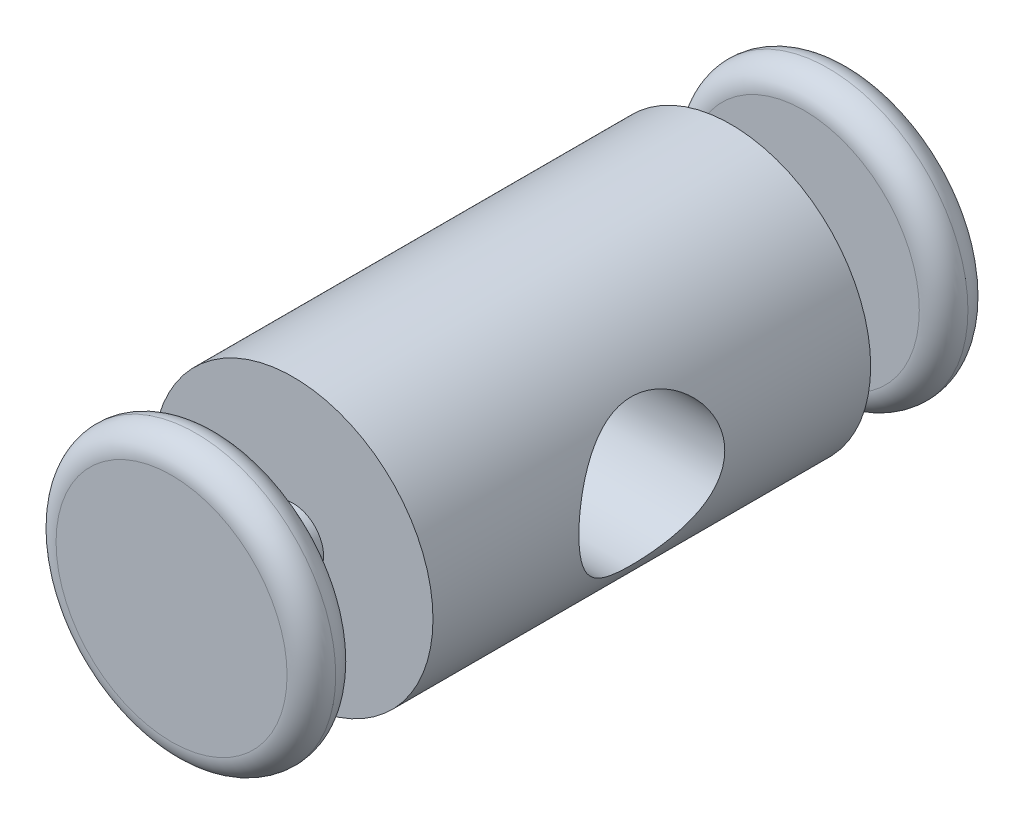
ISO-10303-21;
HEADER;
FILE_DESCRIPTION(('STEP AP214'),'2;1');
FILE_NAME('part.step','',(''),(''),'','','');
FILE_SCHEMA(('AUTOMOTIVE_DESIGN { 1 0 10303 214 1 1 1 1 }'));
ENDSEC;
DATA;
#1=APPLICATION_CONTEXT('core data for automotive mechanical design processes');
#2=APPLICATION_PROTOCOL_DEFINITION('international standard','automotive_design',2000,#1);
#3=PRODUCT_CONTEXT('',#1,'mechanical');
#4=PRODUCT('Part','Part','',(#3));
#5=PRODUCT_RELATED_PRODUCT_CATEGORY('part','',(#4));
#6=PRODUCT_DEFINITION_FORMATION('','',#4);
#7=PRODUCT_DEFINITION_CONTEXT('part definition',#1,'design');
#8=PRODUCT_DEFINITION('design','',#6,#7);
#9=PRODUCT_DEFINITION_SHAPE('','',#8);
#10=(LENGTH_UNIT() NAMED_UNIT(*) SI_UNIT(.MILLI.,.METRE.));
#11=(NAMED_UNIT(*) PLANE_ANGLE_UNIT() SI_UNIT($,.RADIAN.));
#12=(NAMED_UNIT(*) SI_UNIT($,.STERADIAN.) SOLID_ANGLE_UNIT());
#13=UNCERTAINTY_MEASURE_WITH_UNIT(LENGTH_MEASURE(1.E-05),#10,'distance_accuracy_value','');
#14=(GEOMETRIC_REPRESENTATION_CONTEXT(3) GLOBAL_UNCERTAINTY_ASSIGNED_CONTEXT((#13)) GLOBAL_UNIT_ASSIGNED_CONTEXT((#10,
#11,#12)) REPRESENTATION_CONTEXT('',''));
#15=CARTESIAN_POINT('',(0.,0.,0.));
#16=DIRECTION('',(0.,0.,1.));
#17=DIRECTION('',(1.,0.,0.));
#18=AXIS2_PLACEMENT_3D('',#15,#16,#17);
#19=CARTESIAN_POINT('',(0.,0.,18.));
#20=DIRECTION('',(0.,0.,-1.));
#21=DIRECTION('',(-1.,0.,0.));
#22=AXIS2_PLACEMENT_3D('',#19,#20,#21);
#23=CYLINDRICAL_SURFACE('',#22,11.5);
#24=CARTESIAN_POINT('',(-11.5,0.,-6.));
#25=CARTESIAN_POINT('',(-11.5000001355779,0.156949578828013,-6.00000018262045));
#26=CARTESIAN_POINT('',(-11.496779962264,0.31389754169482,-5.99383515190377));
#27=CARTESIAN_POINT('',(-11.4839818639018,0.62662672321278,-5.96925032429299));
#28=CARTESIAN_POINT('',(-11.4744015461444,0.782407480443761,-5.95082591537107));
#29=CARTESIAN_POINT('',(-11.449113177051,1.09175175440846,-5.90191753135049));
#30=CARTESIAN_POINT('',(-11.4333976079975,1.24531231034333,-5.87141876050534));
#31=CARTESIAN_POINT('',(-11.3962303126682,1.54898348882052,-5.79871024455504));
#32=CARTESIAN_POINT('',(-11.374776242212,1.69909267420191,-5.75649571329124));
#33=CARTESIAN_POINT('',(-11.3267626640489,1.99416223199407,-5.66102891920832));
#34=CARTESIAN_POINT('',(-11.3002263208967,2.1391425588515,-5.60782665445636));
#35=CARTESIAN_POINT('',(-11.242605583116,2.42383122801699,-5.49078903598036));
#36=CARTESIAN_POINT('',(-11.2115194736562,2.5635375574422,-5.42694967181545));
#37=CARTESIAN_POINT('',(-11.1124815994392,2.97347192891134,-5.22033899187204));
#38=CARTESIAN_POINT('',(-11.0386979829442,3.23482328090003,-5.06237435139018));
#39=CARTESIAN_POINT('',(-10.8767973262684,3.74452958045324,-4.69923611516626));
#40=CARTESIAN_POINT('',(-10.7880643171826,3.99097418237579,-4.49168348355608));
#41=CARTESIAN_POINT('',(-10.6080279075606,4.44746391289365,-4.04018397814692));
#42=CARTESIAN_POINT('',(-10.5167224332789,4.65747863814188,-3.79620701855532));
#43=CARTESIAN_POINT('',(-10.3807564849467,4.9500372667915,-3.39525217625011));
#44=CARTESIAN_POINT('',(-10.3338194266376,5.04702452632478,-3.24936331256475));
#45=CARTESIAN_POINT('',(-10.243318226809,5.22825678412562,-2.94891015824408));
#46=CARTESIAN_POINT('',(-10.1997526568336,5.3125071934178,-2.79434959010944));
#47=CARTESIAN_POINT('',(-10.1175068939614,5.46751898205415,-2.47737077950324));
#48=CARTESIAN_POINT('',(-10.0788263293965,5.53828138782106,-2.31495313612708));
#49=CARTESIAN_POINT('',(-10.0078700406709,5.66549605291697,-1.98334549078617));
#50=CARTESIAN_POINT('',(-9.97559037714005,5.72195711983363,-1.81415973172985));
#51=CARTESIAN_POINT('',(-9.92054619063594,5.81683662761802,-1.48073913098547));
#52=CARTESIAN_POINT('',(-9.89732024339665,5.85614780407481,-1.3168349660179));
#53=CARTESIAN_POINT('',(-9.85870819120575,5.92092061333048,-0.985481152489066));
#54=CARTESIAN_POINT('',(-9.84331774125874,5.94638992234961,-0.818033522652497));
#55=CARTESIAN_POINT('',(-9.82106263754177,5.98307546018693,-0.481141485903813));
#56=CARTESIAN_POINT('',(-9.81419169245375,5.99430220671729,-0.311698645834845));
#57=CARTESIAN_POINT('',(-9.80928110826297,6.00233545828592,0.0276480579803447));
#58=CARTESIAN_POINT('',(-9.81124048475129,5.99914357072103,0.19755186822696));
#59=CARTESIAN_POINT('',(-9.82304398186207,5.97979128876469,0.51352360962145));
#60=CARTESIAN_POINT('',(-9.8318008420255,5.96541862727512,0.659746262263789));
#61=CARTESIAN_POINT('',(-9.85556101429154,5.92608183096438,0.950290027245845));
#62=CARTESIAN_POINT('',(-9.87056626294253,5.90111441248935,1.09461053574011));
#63=CARTESIAN_POINT('',(-9.90632463124334,5.84088654816273,1.38034672465066));
#64=CARTESIAN_POINT('',(-9.92707729969522,5.80562691028427,1.52176263215529));
#65=CARTESIAN_POINT('',(-9.97367980424171,5.72519555337458,1.80090697735693));
#66=CARTESIAN_POINT('',(-9.99953165490471,5.68001991596398,1.93863393312992));
#67=CARTESIAN_POINT('',(-10.0848968911938,5.5279839659833,2.35127008986333));
#68=CARTESIAN_POINT('',(-10.1513811071148,5.40595529204078,2.61932137568859));
#69=CARTESIAN_POINT('',(-10.2956624209485,5.12582570187863,3.13233832170076));
#70=CARTESIAN_POINT('',(-10.3734645770196,4.96770863914093,3.37729357882386));
#71=CARTESIAN_POINT('',(-10.5447319025564,4.59418299191638,3.87335238223689));
#72=CARTESIAN_POINT('',(-10.6388667848999,4.37385657367154,4.12053410943194));
#73=CARTESIAN_POINT('',(-10.8235162312259,3.89452386552147,4.5762402813956));
#74=CARTESIAN_POINT('',(-10.9140287388104,3.63549598915202,4.78474300580679));
#75=CARTESIAN_POINT('',(-11.0427084943075,3.21432111616678,5.06942258731698));
#76=CARTESIAN_POINT('',(-11.0854180973587,3.06415302608552,5.16160643824063));
#77=CARTESIAN_POINT('',(-11.1661770963876,2.75534105655066,5.33284393580427));
#78=CARTESIAN_POINT('',(-11.2042284688993,2.59670081324254,5.41190315646262));
#79=CARTESIAN_POINT('',(-11.274547726851,2.27203832366379,5.55602186298455));
#80=CARTESIAN_POINT('',(-11.3068181982645,2.10601941978382,5.62108761118108));
#81=CARTESIAN_POINT('',(-11.3646092392143,1.76778722899724,5.73644830342684));
#82=CARTESIAN_POINT('',(-11.3901306632039,1.59557472936093,5.78674511736463));
#83=CARTESIAN_POINT('',(-11.4317037739775,1.26171558673625,5.86813103172292));
#84=CARTESIAN_POINT('',(-11.4483886224873,1.10046276945592,5.90051563500229));
#85=CARTESIAN_POINT('',(-11.4749948435218,0.775301200908924,5.9519739570192));
#86=CARTESIAN_POINT('',(-11.4849168870103,0.611392714773791,5.9710489962542));
#87=CARTESIAN_POINT('',(-11.4977115427036,0.282358074725211,5.99562178270494));
#88=CARTESIAN_POINT('',(-11.5005872021086,0.117232478147391,6.00112539887258));
#89=CARTESIAN_POINT('',(-11.4992139337846,-0.212876139333156,5.99849344051178));
#90=CARTESIAN_POINT('',(-11.494965378924,-0.3778591672455,5.99035857979601));
#91=CARTESIAN_POINT('',(-11.4801392838329,-0.692077607348069,5.96185612461983));
#92=CARTESIAN_POINT('',(-11.4701395533605,-0.84144333885876,5.94260475543453));
#93=CARTESIAN_POINT('',(-11.4445338372521,-1.13788568955102,5.89303027605832));
#94=CARTESIAN_POINT('',(-11.4289260907783,-1.28496157460335,5.8627036883562));
#95=CARTESIAN_POINT('',(-11.3924726565118,-1.57576547001356,5.791318826621));
#96=CARTESIAN_POINT('',(-11.3716286147179,-1.71949451694571,5.7502639248081));
#97=CARTESIAN_POINT('',(-11.3251593447799,-2.00284565139829,5.65781144649547));
#98=CARTESIAN_POINT('',(-11.2995322541789,-2.14246611448912,5.6064098405095));
#99=CARTESIAN_POINT('',(-11.2433297744297,-2.42036025169913,5.49226711627424));
#100=CARTESIAN_POINT('',(-11.212643127812,-2.55850470284519,5.42926609647112));
#101=CARTESIAN_POINT('',(-11.1474867251275,-2.82894302130077,5.29339248396463));
#102=CARTESIAN_POINT('',(-11.1130156903428,-2.96123488974968,5.22051655263843));
#103=CARTESIAN_POINT('',(-11.0050011672394,-3.34837031438132,4.98788532913089));
#104=CARTESIAN_POINT('',(-10.9268248816615,-3.59362293177135,4.81406476637323));
#105=CARTESIAN_POINT('',(-10.7558845893354,-4.07845441766782,4.41308062583474));
#106=CARTESIAN_POINT('',(-10.6624498887889,-4.31476155891882,4.18224068751647));
#107=CARTESIAN_POINT('',(-10.5236283447289,-4.63865684293515,3.80920784754676));
#108=CARTESIAN_POINT('',(-10.4775407642409,-4.74159614201419,3.68029020728233));
#109=CARTESIAN_POINT('',(-10.3869914671592,-4.93679704899907,3.41398249926734));
#110=CARTESIAN_POINT('',(-10.342530014046,-5.0290569317233,3.2765910681174));
#111=CARTESIAN_POINT('',(-10.2538835713497,-5.20753347811362,2.98538298472546));
#112=CARTESIAN_POINT('',(-10.2098799999888,-5.29304089939067,2.83107557841413));
#113=CARTESIAN_POINT('',(-10.1266797724421,-5.45053097521652,2.51454537611282));
#114=CARTESIAN_POINT('',(-10.0874807984915,-5.52252016002727,2.35232644990204));
#115=CARTESIAN_POINT('',(-10.0154153379937,-5.65216403762049,2.02105131937274));
#116=CARTESIAN_POINT('',(-9.98254333857722,-5.70983122240021,1.85200122409344));
#117=CARTESIAN_POINT('',(-9.92451532693214,-5.81010867727672,1.5082048281158));
#118=CARTESIAN_POINT('',(-9.89935799881863,-5.85272151536934,1.33345950447927));
#119=CARTESIAN_POINT('',(-9.85997735719745,-5.91879845654421,0.997125596417494));
#120=CARTESIAN_POINT('',(-9.84492546066004,-5.94372747316169,0.835921212389536));
#121=CARTESIAN_POINT('',(-9.8226998129173,-5.98038742493022,0.511477725647173));
#122=CARTESIAN_POINT('',(-9.81552550378247,-5.99211929476957,0.348238767859586));
#123=CARTESIAN_POINT('',(-9.80937042445035,-6.00219018121765,0.0212746956513033));
#124=CARTESIAN_POINT('',(-9.8103856001657,-6.00053582448518,-0.142450138120793));
#125=CARTESIAN_POINT('',(-9.8205546927914,-5.98387835527525,-0.468955429442394));
#126=CARTESIAN_POINT('',(-9.82970815295026,-5.96887599193866,-0.63173593947489));
#127=CARTESIAN_POINT('',(-9.85429043436739,-5.9281912772814,-0.936742751821819));
#128=CARTESIAN_POINT('',(-9.8688984859434,-5.90389851592597,-1.07922324730548));
#129=CARTESIAN_POINT('',(-9.90372810988935,-5.84528177464224,-1.36142472318204));
#130=CARTESIAN_POINT('',(-9.92395151971456,-5.81095451103376,-1.5011447842494));
#131=CARTESIAN_POINT('',(-9.99214740783945,-5.6934422344186,-1.91488554677635));
#132=CARTESIAN_POINT('',(-10.0476618132275,-5.59570137647594,-2.18367293189669));
#133=CARTESIAN_POINT('',(-10.1769405832222,-5.35717564237034,-2.71886242225505));
#134=CARTESIAN_POINT('',(-10.2516663146063,-5.21397923406321,-2.98394079537056));
#135=CARTESIAN_POINT('',(-10.4095819630624,-4.8911095660573,-3.48808983239893));
#136=CARTESIAN_POINT('',(-10.4927764121656,-4.71141672357171,-3.72714642766466));
#137=CARTESIAN_POINT('',(-10.6718711921826,-4.29183181980602,-4.2065242224796));
#138=CARTESIAN_POINT('',(-10.7679568339543,-4.04707182811809,-4.4425706468183));
#139=CARTESIAN_POINT('',(-10.9057916851509,-3.6514874658084,-4.76399275734891));
#140=CARTESIAN_POINT('',(-10.9507237321279,-3.5147550364512,-4.86576586077563));
#141=CARTESIAN_POINT('',(-11.0373504171677,-3.2324366198641,-5.05771159354309));
#142=CARTESIAN_POINT('',(-11.0790464997228,-3.08685463531811,-5.14788941081377));
#143=CARTESIAN_POINT('',(-11.1588253208791,-2.78486276212108,-5.31743165196371));
#144=CARTESIAN_POINT('',(-11.1968278691941,-2.62830336717773,-5.39656770964361));
#145=CARTESIAN_POINT('',(-11.2672374830238,-2.30786598455685,-5.54117575722826));
#146=CARTESIAN_POINT('',(-11.2996473027075,-2.14399164949463,-5.60665447609682));
#147=CARTESIAN_POINT('',(-11.3578623353638,-1.81040554038438,-5.72307380861668));
#148=CARTESIAN_POINT('',(-11.3836812442014,-1.64070671649353,-5.77404459543316));
#149=CARTESIAN_POINT('',(-11.4279822417378,-1.29664056140088,-5.86090237441121));
#150=CARTESIAN_POINT('',(-11.4464685472303,-1.12227597512955,-5.89679803659391));
#151=CARTESIAN_POINT('',(-11.4738827208415,-0.79028551012741,-5.94982642127283));
#152=CARTESIAN_POINT('',(-11.483654127812,-0.632992460182275,-5.96861998891456));
#153=CARTESIAN_POINT('',(-11.4967127694845,-0.31713240879531,-5.99370682209347));
#154=CARTESIAN_POINT('',(-11.4999998630263,-0.158565379695044,-5.99999981549947));
#155=CARTESIAN_POINT('',(-11.5,0.,-6.));
#156=B_SPLINE_CURVE_WITH_KNOTS('',3,(#24,#25,#26,#27,#28,#29,#30,#31,#32,#33,#34,#35,#36,#37,
#38,#39,#40,#41,#42,#43,#44,#45,#46,#47,#48,#49,#50,#51,#52,#53,#54,#55,#56,#57,#58,#59,#60,#61,
#62,#63,#64,#65,#66,#67,#68,#69,#70,#71,#72,#73,#74,#75,#76,#77,#78,#79,#80,#81,#82,#83,#84,#85,
#86,#87,#88,#89,#90,#91,#92,#93,#94,#95,#96,#97,#98,#99,#100,#101,#102,#103,#104,#105,#106,#107,
#108,#109,#110,#111,#112,#113,#114,#115,#116,#117,#118,#119,#120,#121,#122,#123,#124,#125,#126,
#127,#128,#129,#130,#131,#132,#133,#134,#135,#136,#137,#138,#139,#140,#141,#142,#143,#144,#145,
#146,#147,#148,#149,#150,#151,#152,#153,#154,#155),.UNSPECIFIED.,.T.,.F.,(4,2,2,2,2,2,2,2,2,2,2,
2,2,2,2,2,2,2,2,2,2,2,2,2,2,2,2,2,2,2,2,2,2,2,2,2,2,2,2,2,2,2,2,2,2,2,2,2,2,2,2,2,2,2,2,2,2,2,2,
2,2,2,2,2,2,4),(0.,0.470692988347527,0.941563153500217,1.41301211091961,1.88465395034882,
2.35419515677509,2.82391379370479,3.76237773296836,4.76106646584416,5.76058470750014,
6.30410876981105,6.84740127274561,7.39065241517702,7.93356817434236,8.4432575664312,
8.95266401326091,9.46169405906647,9.97066735933802,10.4117092732762,10.8528879801556,
11.2940320623631,11.7353507807,12.6372965018234,13.5396465616096,14.5680573329444,
15.597043875982,16.140352845317,16.6834304782373,17.2262645659939,17.7690298960917,
18.2643078023531,18.7595365630343,19.2545511248155,19.749539779258,20.2018125668465,
20.6542274859734,21.1065003686736,21.5589497293685,22.0231534673376,22.4875145420254,
23.4157482798121,24.4409922351983,24.9544170464423,25.4679246823015,26.0126762775516,
26.557164038545,27.1011752028526,27.6450935239605,28.1358290947884,28.6265299070667,
29.1169878198374,29.6074182079819,30.0427373760832,30.4781991573565,31.3485636603898,
32.2762679094131,33.2044712553565,34.2592761503954,34.7875907669549,35.3156681778426,
35.8534199346152,36.3909061122233,36.92726613486,37.4633172617339,37.9388456973503,
38.4143844848669),.UNSPECIFIED.);
#157=CARTESIAN_POINT('',(-11.5,0.,-6.));
#158=VERTEX_POINT('',#157);
#159=EDGE_CURVE('E10',#158,#158,#156,.T.);
#160=ORIENTED_EDGE('',*,*,#159,.T.);
#161=EDGE_LOOP('',(#160));
#162=FACE_BOUND('',#161,.T.);
#163=CARTESIAN_POINT('',(11.5,0.,-6.));
#164=CARTESIAN_POINT('',(11.5000001355779,-0.156949578828013,-6.00000018262045));
#165=CARTESIAN_POINT('',(11.496779962264,-0.31389754169482,-5.99383515190377));
#166=CARTESIAN_POINT('',(11.4839818639018,-0.62662672321278,-5.96925032429299));
#167=CARTESIAN_POINT('',(11.4744015461444,-0.782407480443761,-5.95082591537107));
#168=CARTESIAN_POINT('',(11.449113177051,-1.09175175440846,-5.90191753135049));
#169=CARTESIAN_POINT('',(11.4333976079975,-1.24531231034333,-5.87141876050534));
#170=CARTESIAN_POINT('',(11.3962303126682,-1.54898348882052,-5.79871024455504));
#171=CARTESIAN_POINT('',(11.374776242212,-1.69909267420191,-5.75649571329124));
#172=CARTESIAN_POINT('',(11.3267626640489,-1.99416223199407,-5.66102891920832));
#173=CARTESIAN_POINT('',(11.3002263208967,-2.1391425588515,-5.60782665445636));
#174=CARTESIAN_POINT('',(11.242605583116,-2.42383122801699,-5.49078903598036));
#175=CARTESIAN_POINT('',(11.2115194736562,-2.5635375574422,-5.42694967181545));
#176=CARTESIAN_POINT('',(11.1124815994392,-2.97347192891134,-5.22033899187204));
#177=CARTESIAN_POINT('',(11.0386979829442,-3.23482328090003,-5.06237435139018));
#178=CARTESIAN_POINT('',(10.8767973262684,-3.74452958045324,-4.69923611516626));
#179=CARTESIAN_POINT('',(10.7880643171826,-3.99097418237579,-4.49168348355608));
#180=CARTESIAN_POINT('',(10.6080279075606,-4.44746391289365,-4.04018397814692));
#181=CARTESIAN_POINT('',(10.5167224332789,-4.65747863814188,-3.79620701855532));
#182=CARTESIAN_POINT('',(10.3807564849467,-4.9500372667915,-3.39525217625011));
#183=CARTESIAN_POINT('',(10.3338194266376,-5.04702452632478,-3.24936331256475));
#184=CARTESIAN_POINT('',(10.243318226809,-5.22825678412562,-2.94891015824408));
#185=CARTESIAN_POINT('',(10.1997526568336,-5.3125071934178,-2.79434959010944));
#186=CARTESIAN_POINT('',(10.1175068939614,-5.46751898205415,-2.47737077950324));
#187=CARTESIAN_POINT('',(10.0788263293965,-5.53828138782106,-2.31495313612708));
#188=CARTESIAN_POINT('',(10.0078700406709,-5.66549605291697,-1.98334549078617));
#189=CARTESIAN_POINT('',(9.97559037714005,-5.72195711983363,-1.81415973172985));
#190=CARTESIAN_POINT('',(9.92054619063594,-5.81683662761802,-1.48073913098547));
#191=CARTESIAN_POINT('',(9.89732024339665,-5.85614780407481,-1.3168349660179));
#192=CARTESIAN_POINT('',(9.85870819120575,-5.92092061333048,-0.985481152489066));
#193=CARTESIAN_POINT('',(9.84331774125874,-5.94638992234961,-0.818033522652497));
#194=CARTESIAN_POINT('',(9.82106263754177,-5.98307546018693,-0.481141485903813));
#195=CARTESIAN_POINT('',(9.81419169245375,-5.99430220671729,-0.311698645834845));
#196=CARTESIAN_POINT('',(9.80928110826297,-6.00233545828592,0.0276480579803447));
#197=CARTESIAN_POINT('',(9.81124048475129,-5.99914357072103,0.19755186822696));
#198=CARTESIAN_POINT('',(9.82304398186207,-5.97979128876469,0.51352360962145));
#199=CARTESIAN_POINT('',(9.8318008420255,-5.96541862727512,0.659746262263789));
#200=CARTESIAN_POINT('',(9.85556101429154,-5.92608183096438,0.950290027245845));
#201=CARTESIAN_POINT('',(9.87056626294253,-5.90111441248935,1.09461053574011));
#202=CARTESIAN_POINT('',(9.90632463124334,-5.84088654816273,1.38034672465066));
#203=CARTESIAN_POINT('',(9.92707729969522,-5.80562691028427,1.52176263215529));
#204=CARTESIAN_POINT('',(9.97367980424171,-5.72519555337458,1.80090697735693));
#205=CARTESIAN_POINT('',(9.99953165490471,-5.68001991596398,1.93863393312992));
#206=CARTESIAN_POINT('',(10.0848968911938,-5.5279839659833,2.35127008986333));
#207=CARTESIAN_POINT('',(10.1513811071148,-5.40595529204078,2.61932137568859));
#208=CARTESIAN_POINT('',(10.2956624209485,-5.12582570187863,3.13233832170076));
#209=CARTESIAN_POINT('',(10.3734645770196,-4.96770863914093,3.37729357882386));
#210=CARTESIAN_POINT('',(10.5447319025564,-4.59418299191638,3.87335238223689));
#211=CARTESIAN_POINT('',(10.6388667848999,-4.37385657367154,4.12053410943194));
#212=CARTESIAN_POINT('',(10.8235162312259,-3.89452386552147,4.5762402813956));
#213=CARTESIAN_POINT('',(10.9140287388104,-3.63549598915202,4.78474300580679));
#214=CARTESIAN_POINT('',(11.0427084943075,-3.21432111616678,5.06942258731698));
#215=CARTESIAN_POINT('',(11.0854180973587,-3.06415302608552,5.16160643824063));
#216=CARTESIAN_POINT('',(11.1661770963876,-2.75534105655066,5.33284393580427));
#217=CARTESIAN_POINT('',(11.2042284688993,-2.59670081324254,5.41190315646262));
#218=CARTESIAN_POINT('',(11.274547726851,-2.27203832366379,5.55602186298455));
#219=CARTESIAN_POINT('',(11.3068181982645,-2.10601941978382,5.62108761118108));
#220=CARTESIAN_POINT('',(11.3646092392143,-1.76778722899724,5.73644830342684));
#221=CARTESIAN_POINT('',(11.3901306632039,-1.59557472936093,5.78674511736463));
#222=CARTESIAN_POINT('',(11.4317037739775,-1.26171558673625,5.86813103172292));
#223=CARTESIAN_POINT('',(11.4483886224873,-1.10046276945592,5.90051563500229));
#224=CARTESIAN_POINT('',(11.4749948435218,-0.775301200908924,5.9519739570192));
#225=CARTESIAN_POINT('',(11.4849168870103,-0.611392714773791,5.9710489962542));
#226=CARTESIAN_POINT('',(11.4977115427036,-0.282358074725211,5.99562178270494));
#227=CARTESIAN_POINT('',(11.5005872021086,-0.117232478147391,6.00112539887258));
#228=CARTESIAN_POINT('',(11.4992139337846,0.212876139333156,5.99849344051178));
#229=CARTESIAN_POINT('',(11.494965378924,0.3778591672455,5.99035857979601));
#230=CARTESIAN_POINT('',(11.4801392838329,0.692077607348069,5.96185612461983));
#231=CARTESIAN_POINT('',(11.4701395533605,0.84144333885876,5.94260475543453));
#232=CARTESIAN_POINT('',(11.4445338372521,1.13788568955102,5.89303027605832));
#233=CARTESIAN_POINT('',(11.4289260907783,1.28496157460335,5.8627036883562));
#234=CARTESIAN_POINT('',(11.3924726565118,1.57576547001356,5.791318826621));
#235=CARTESIAN_POINT('',(11.3716286147179,1.71949451694571,5.7502639248081));
#236=CARTESIAN_POINT('',(11.3251593447799,2.00284565139829,5.65781144649547));
#237=CARTESIAN_POINT('',(11.2995322541789,2.14246611448912,5.6064098405095));
#238=CARTESIAN_POINT('',(11.2433297744297,2.42036025169913,5.49226711627424));
#239=CARTESIAN_POINT('',(11.212643127812,2.55850470284519,5.42926609647112));
#240=CARTESIAN_POINT('',(11.1474867251275,2.82894302130077,5.29339248396463));
#241=CARTESIAN_POINT('',(11.1130156903428,2.96123488974968,5.22051655263843));
#242=CARTESIAN_POINT('',(11.0050011672394,3.34837031438132,4.98788532913089));
#243=CARTESIAN_POINT('',(10.9268248816615,3.59362293177135,4.81406476637323));
#244=CARTESIAN_POINT('',(10.7558845893354,4.07845441766782,4.41308062583474));
#245=CARTESIAN_POINT('',(10.6624498887889,4.31476155891882,4.18224068751647));
#246=CARTESIAN_POINT('',(10.5236283447289,4.63865684293515,3.80920784754676));
#247=CARTESIAN_POINT('',(10.4775407642409,4.74159614201419,3.68029020728233));
#248=CARTESIAN_POINT('',(10.3869914671592,4.93679704899907,3.41398249926734));
#249=CARTESIAN_POINT('',(10.342530014046,5.0290569317233,3.2765910681174));
#250=CARTESIAN_POINT('',(10.2538835713497,5.20753347811362,2.98538298472546));
#251=CARTESIAN_POINT('',(10.2098799999888,5.29304089939067,2.83107557841413));
#252=CARTESIAN_POINT('',(10.1266797724421,5.45053097521652,2.51454537611282));
#253=CARTESIAN_POINT('',(10.0874807984915,5.52252016002727,2.35232644990204));
#254=CARTESIAN_POINT('',(10.0154153379937,5.65216403762049,2.02105131937274));
#255=CARTESIAN_POINT('',(9.98254333857722,5.70983122240021,1.85200122409344));
#256=CARTESIAN_POINT('',(9.92451532693214,5.81010867727672,1.5082048281158));
#257=CARTESIAN_POINT('',(9.89935799881863,5.85272151536934,1.33345950447927));
#258=CARTESIAN_POINT('',(9.85997735719745,5.91879845654421,0.997125596417494));
#259=CARTESIAN_POINT('',(9.84492546066004,5.94372747316169,0.835921212389536));
#260=CARTESIAN_POINT('',(9.8226998129173,5.98038742493022,0.511477725647173));
#261=CARTESIAN_POINT('',(9.81552550378247,5.99211929476957,0.348238767859586));
#262=CARTESIAN_POINT('',(9.80937042445035,6.00219018121765,0.0212746956513033));
#263=CARTESIAN_POINT('',(9.8103856001657,6.00053582448518,-0.142450138120793));
#264=CARTESIAN_POINT('',(9.8205546927914,5.98387835527525,-0.468955429442394));
#265=CARTESIAN_POINT('',(9.82970815295026,5.96887599193866,-0.63173593947489));
#266=CARTESIAN_POINT('',(9.85429043436739,5.9281912772814,-0.936742751821819));
#267=CARTESIAN_POINT('',(9.8688984859434,5.90389851592597,-1.07922324730548));
#268=CARTESIAN_POINT('',(9.90372810988935,5.84528177464224,-1.36142472318204));
#269=CARTESIAN_POINT('',(9.92395151971456,5.81095451103376,-1.5011447842494));
#270=CARTESIAN_POINT('',(9.99214740783945,5.6934422344186,-1.91488554677635));
#271=CARTESIAN_POINT('',(10.0476618132275,5.59570137647594,-2.18367293189669));
#272=CARTESIAN_POINT('',(10.1769405832222,5.35717564237034,-2.71886242225505));
#273=CARTESIAN_POINT('',(10.2516663146063,5.21397923406321,-2.98394079537056));
#274=CARTESIAN_POINT('',(10.4095819630624,4.8911095660573,-3.48808983239893));
#275=CARTESIAN_POINT('',(10.4927764121656,4.71141672357171,-3.72714642766466));
#276=CARTESIAN_POINT('',(10.6718711921826,4.29183181980602,-4.2065242224796));
#277=CARTESIAN_POINT('',(10.7679568339543,4.04707182811809,-4.4425706468183));
#278=CARTESIAN_POINT('',(10.9057916851509,3.6514874658084,-4.76399275734891));
#279=CARTESIAN_POINT('',(10.9507237321279,3.5147550364512,-4.86576586077563));
#280=CARTESIAN_POINT('',(11.0373504171677,3.2324366198641,-5.05771159354309));
#281=CARTESIAN_POINT('',(11.0790464997228,3.08685463531811,-5.14788941081377));
#282=CARTESIAN_POINT('',(11.1588253208791,2.78486276212108,-5.31743165196371));
#283=CARTESIAN_POINT('',(11.1968278691941,2.62830336717773,-5.39656770964361));
#284=CARTESIAN_POINT('',(11.2672374830238,2.30786598455685,-5.54117575722826));
#285=CARTESIAN_POINT('',(11.2996473027075,2.14399164949463,-5.60665447609682));
#286=CARTESIAN_POINT('',(11.3578623353638,1.81040554038438,-5.72307380861668));
#287=CARTESIAN_POINT('',(11.3836812442014,1.64070671649353,-5.77404459543316));
#288=CARTESIAN_POINT('',(11.4279822417378,1.29664056140088,-5.86090237441121));
#289=CARTESIAN_POINT('',(11.4464685472303,1.12227597512955,-5.89679803659391));
#290=CARTESIAN_POINT('',(11.4738827208415,0.79028551012741,-5.94982642127283));
#291=CARTESIAN_POINT('',(11.483654127812,0.632992460182275,-5.96861998891456));
#292=CARTESIAN_POINT('',(11.4967127694845,0.31713240879531,-5.99370682209347));
#293=CARTESIAN_POINT('',(11.4999998630263,0.158565379695044,-5.99999981549947));
#294=CARTESIAN_POINT('',(11.5,0.,-6.));
#295=B_SPLINE_CURVE_WITH_KNOTS('',3,(#163,#164,#165,#166,#167,#168,#169,#170,#171,#172,#173,
#174,#175,#176,#177,#178,#179,#180,#181,#182,#183,#184,#185,#186,#187,#188,#189,#190,#191,#192,
#193,#194,#195,#196,#197,#198,#199,#200,#201,#202,#203,#204,#205,#206,#207,#208,#209,#210,#211,
#212,#213,#214,#215,#216,#217,#218,#219,#220,#221,#222,#223,#224,#225,#226,#227,#228,#229,#230,
#231,#232,#233,#234,#235,#236,#237,#238,#239,#240,#241,#242,#243,#244,#245,#246,#247,#248,#249,
#250,#251,#252,#253,#254,#255,#256,#257,#258,#259,#260,#261,#262,#263,#264,#265,#266,#267,#268,
#269,#270,#271,#272,#273,#274,#275,#276,#277,#278,#279,#280,#281,#282,#283,#284,#285,#286,#287,
#288,#289,#290,#291,#292,#293,#294),.UNSPECIFIED.,.T.,.F.,(4,2,2,2,2,2,2,2,2,2,2,2,2,2,2,2,2,2,
2,2,2,2,2,2,2,2,2,2,2,2,2,2,2,2,2,2,2,2,2,2,2,2,2,2,2,2,2,2,2,2,2,2,2,2,2,2,2,2,2,2,2,2,2,2,2,
4),(0.,0.470692988347527,0.941563153500217,1.41301211091961,1.88465395034882,2.35419515677509,
2.82391379370479,3.76237773296836,4.76106646584416,5.76058470750014,6.30410876981105,
6.84740127274561,7.39065241517702,7.93356817434236,8.4432575664312,8.95266401326091,
9.46169405906647,9.97066735933802,10.4117092732762,10.8528879801556,11.2940320623631,
11.7353507807,12.6372965018234,13.5396465616096,14.5680573329444,15.597043875982,
16.140352845317,16.6834304782373,17.2262645659939,17.7690298960917,18.2643078023531,
18.7595365630343,19.2545511248155,19.749539779258,20.2018125668465,20.6542274859734,
21.1065003686736,21.5589497293685,22.0231534673376,22.4875145420254,23.4157482798121,
24.4409922351983,24.9544170464423,25.4679246823015,26.0126762775516,26.557164038545,
27.1011752028526,27.6450935239605,28.1358290947884,28.6265299070667,29.1169878198374,
29.6074182079819,30.0427373760832,30.4781991573565,31.3485636603898,32.2762679094131,
33.2044712553565,34.2592761503954,34.7875907669549,35.3156681778426,35.8534199346152,
36.3909061122233,36.92726613486,37.4633172617339,37.9388456973503,38.4143844848669),.UNSPECIFIED.);
#296=CARTESIAN_POINT('',(11.5,0.,-6.));
#297=VERTEX_POINT('',#296);
#298=EDGE_CURVE('E41',#297,#297,#295,.T.);
#299=ORIENTED_EDGE('',*,*,#298,.T.);
#300=EDGE_LOOP('',(#299));
#301=FACE_BOUND('',#300,.T.);
#302=CARTESIAN_POINT('',(0.,0.,18.));
#303=DIRECTION('',(0.,0.,1.));
#304=DIRECTION('',(1.,0.,0.));
#305=AXIS2_PLACEMENT_3D('',#302,#303,#304);
#306=CIRCLE('',#305,11.5);
#307=CARTESIAN_POINT('',(11.5,0.,18.));
#308=VERTEX_POINT('',#307);
#309=EDGE_CURVE('E111',#308,#308,#306,.T.);
#310=ORIENTED_EDGE('',*,*,#309,.F.);
#311=EDGE_LOOP('',(#310));
#312=FACE_BOUND('',#311,.T.);
#313=CARTESIAN_POINT('',(0.,0.,-18.));
#314=DIRECTION('',(0.,0.,1.));
#315=DIRECTION('',(1.,0.,0.));
#316=AXIS2_PLACEMENT_3D('',#313,#314,#315);
#317=CIRCLE('',#316,11.5);
#318=CARTESIAN_POINT('',(11.5,0.,-18.));
#319=VERTEX_POINT('',#318);
#320=EDGE_CURVE('E144',#319,#319,#317,.T.);
#321=ORIENTED_EDGE('',*,*,#320,.T.);
#322=EDGE_LOOP('',(#321));
#323=FACE_BOUND('',#322,.T.);
#324=ADVANCED_FACE('F30',(#162,#301,#312,#323),#23,.T.);
#325=CARTESIAN_POINT('',(0.,0.,18.));
#326=DIRECTION('',(0.,0.,1.));
#327=DIRECTION('',(1.,0.,0.));
#328=AXIS2_PLACEMENT_3D('',#325,#326,#327);
#329=PLANE('',#328);
#330=CARTESIAN_POINT('',(0.,0.,18.));
#331=DIRECTION('',(0.,0.,1.));
#332=DIRECTION('',(1.,0.,0.));
#333=AXIS2_PLACEMENT_3D('',#330,#331,#332);
#334=CIRCLE('',#333,2.5);
#335=CARTESIAN_POINT('',(2.5,0.,18.));
#336=VERTEX_POINT('',#335);
#337=EDGE_CURVE('E108',#336,#336,#334,.T.);
#338=ORIENTED_EDGE('',*,*,#337,.F.);
#339=EDGE_LOOP('',(#338));
#340=FACE_BOUND('',#339,.T.);
#341=ORIENTED_EDGE('',*,*,#309,.T.);
#342=EDGE_LOOP('',(#341));
#343=FACE_BOUND('',#342,.T.);
#344=ADVANCED_FACE('F98',(#340,#343),#329,.T.);
#345=CARTESIAN_POINT('',(0.,0.,24.));
#346=DIRECTION('',(0.,0.,-1.));
#347=DIRECTION('',(-1.,0.,0.));
#348=AXIS2_PLACEMENT_3D('',#345,#346,#347);
#349=CYLINDRICAL_SURFACE('',#348,2.5);
#350=CARTESIAN_POINT('',(0.,0.,24.));
#351=DIRECTION('',(0.,0.,1.));
#352=DIRECTION('',(1.,0.,0.));
#353=AXIS2_PLACEMENT_3D('',#350,#351,#352);
#354=CIRCLE('',#353,2.5);
#355=CARTESIAN_POINT('',(2.5,0.,24.));
#356=VERTEX_POINT('',#355);
#357=EDGE_CURVE('E113',#356,#356,#354,.T.);
#358=ORIENTED_EDGE('',*,*,#357,.F.);
#359=EDGE_LOOP('',(#358));
#360=FACE_BOUND('',#359,.T.);
#361=ORIENTED_EDGE('',*,*,#337,.T.);
#362=EDGE_LOOP('',(#361));
#363=FACE_BOUND('',#362,.T.);
#364=ADVANCED_FACE('F92',(#360,#363),#349,.T.);
#365=CARTESIAN_POINT('',(0.,0.,28.));
#366=DIRECTION('',(0.,0.,1.));
#367=DIRECTION('',(1.,0.,0.));
#368=AXIS2_PLACEMENT_3D('',#365,#366,#367);
#369=PLANE('',#368);
#370=CARTESIAN_POINT('',(0.,0.,28.));
#371=DIRECTION('',(0.,0.,1.));
#372=DIRECTION('',(1.,0.,0.));
#373=AXIS2_PLACEMENT_3D('',#370,#371,#372);
#374=CIRCLE('',#373,9.5);
#375=CARTESIAN_POINT('',(9.5,0.,28.));
#376=VERTEX_POINT('',#375);
#377=EDGE_CURVE('E45',#376,#376,#374,.T.);
#378=ORIENTED_EDGE('',*,*,#377,.T.);
#379=EDGE_LOOP('',(#378));
#380=FACE_BOUND('',#379,.T.);
#381=ADVANCED_FACE('F88',(#380),#369,.T.);
#382=CARTESIAN_POINT('',(0.,0.,24.));
#383=DIRECTION('',(0.,0.,1.));
#384=DIRECTION('',(1.,0.,0.));
#385=AXIS2_PLACEMENT_3D('',#382,#383,#384);
#386=PLANE('',#385);
#387=CARTESIAN_POINT('',(0.,0.,24.));
#388=DIRECTION('',(0.,0.,1.));
#389=DIRECTION('',(1.,0.,0.));
#390=AXIS2_PLACEMENT_3D('',#387,#388,#389);
#391=CIRCLE('',#390,9.5);
#392=CARTESIAN_POINT('',(9.5,0.,24.));
#393=VERTEX_POINT('',#392);
#394=EDGE_CURVE('E49',#393,#393,#391,.F.);
#395=ORIENTED_EDGE('',*,*,#394,.T.);
#396=EDGE_LOOP('',(#395));
#397=FACE_BOUND('',#396,.T.);
#398=ORIENTED_EDGE('',*,*,#357,.T.);
#399=EDGE_LOOP('',(#398));
#400=FACE_BOUND('',#399,.T.);
#401=ADVANCED_FACE('F91',(#397,#400),#386,.F.);
#402=CARTESIAN_POINT('',(0.,0.,26.));
#403=DIRECTION('',(0.,0.,1.));
#404=DIRECTION('',(1.,0.,0.));
#405=AXIS2_PLACEMENT_3D('',#402,#403,#404);
#406=TOROIDAL_SURFACE('',#405,9.5,2.);
#407=ORIENTED_EDGE('',*,*,#377,.F.);
#408=EDGE_LOOP('',(#407));
#409=FACE_BOUND('',#408,.T.);
#410=CARTESIAN_POINT('',(0.,0.,26.));
#411=DIRECTION('',(0.,0.,1.));
#412=DIRECTION('',(1.,0.,0.));
#413=AXIS2_PLACEMENT_3D('',#410,#411,#412);
#414=CIRCLE('',#413,11.5);
#415=CARTESIAN_POINT('',(11.5,0.,26.));
#416=VERTEX_POINT('',#415);
#417=EDGE_CURVE('E54',#416,#416,#414,.F.);
#418=ORIENTED_EDGE('',*,*,#417,.F.);
#419=EDGE_LOOP('',(#418));
#420=FACE_BOUND('',#419,.T.);
#421=ADVANCED_FACE('F32',(#409,#420),#406,.T.);
#422=CARTESIAN_POINT('',(0.,0.,26.));
#423=DIRECTION('',(0.,0.,1.));
#424=DIRECTION('',(1.,0.,0.));
#425=AXIS2_PLACEMENT_3D('',#422,#423,#424);
#426=TOROIDAL_SURFACE('',#425,9.5,2.);
#427=ORIENTED_EDGE('',*,*,#394,.F.);
#428=EDGE_LOOP('',(#427));
#429=FACE_BOUND('',#428,.T.);
#430=ORIENTED_EDGE('',*,*,#417,.T.);
#431=EDGE_LOOP('',(#430));
#432=FACE_BOUND('',#431,.T.);
#433=ADVANCED_FACE('F80',(#429,#432),#426,.T.);
#434=CARTESIAN_POINT('',(0.,0.,-18.));
#435=DIRECTION('',(0.,0.,-1.));
#436=DIRECTION('',(1.,0.,0.));
#437=AXIS2_PLACEMENT_3D('',#434,#435,#436);
#438=PLANE('',#437);
#439=CARTESIAN_POINT('',(0.,0.,-18.));
#440=DIRECTION('',(0.,0.,1.));
#441=DIRECTION('',(1.,0.,0.));
#442=AXIS2_PLACEMENT_3D('',#439,#440,#441);
#443=CIRCLE('',#442,2.5);
#444=CARTESIAN_POINT('',(2.5,0.,-18.));
#445=VERTEX_POINT('',#444);
#446=EDGE_CURVE('E134',#445,#445,#443,.T.);
#447=ORIENTED_EDGE('',*,*,#446,.T.);
#448=EDGE_LOOP('',(#447));
#449=FACE_BOUND('',#448,.T.);
#450=ORIENTED_EDGE('',*,*,#320,.F.);
#451=EDGE_LOOP('',(#450));
#452=FACE_BOUND('',#451,.T.);
#453=ADVANCED_FACE('F76',(#449,#452),#438,.T.);
#454=CARTESIAN_POINT('',(0.,0.,-24.));
#455=DIRECTION('',(0.,0.,1.));
#456=DIRECTION('',(-1.,0.,0.));
#457=AXIS2_PLACEMENT_3D('',#454,#455,#456);
#458=CYLINDRICAL_SURFACE('',#457,2.5);
#459=CARTESIAN_POINT('',(0.,0.,-24.));
#460=DIRECTION('',(0.,0.,1.));
#461=DIRECTION('',(1.,0.,0.));
#462=AXIS2_PLACEMENT_3D('',#459,#460,#461);
#463=CIRCLE('',#462,2.5);
#464=CARTESIAN_POINT('',(2.5,0.,-24.));
#465=VERTEX_POINT('',#464);
#466=EDGE_CURVE('E140',#465,#465,#463,.T.);
#467=ORIENTED_EDGE('',*,*,#466,.T.);
#468=EDGE_LOOP('',(#467));
#469=FACE_BOUND('',#468,.T.);
#470=ORIENTED_EDGE('',*,*,#446,.F.);
#471=EDGE_LOOP('',(#470));
#472=FACE_BOUND('',#471,.T.);
#473=ADVANCED_FACE('F68',(#469,#472),#458,.T.);
#474=CARTESIAN_POINT('',(0.,0.,-28.));
#475=DIRECTION('',(0.,0.,-1.));
#476=DIRECTION('',(1.,0.,0.));
#477=AXIS2_PLACEMENT_3D('',#474,#475,#476);
#478=PLANE('',#477);
#479=CARTESIAN_POINT('',(0.,0.,-28.));
#480=DIRECTION('',(0.,0.,1.));
#481=DIRECTION('',(1.,0.,0.));
#482=AXIS2_PLACEMENT_3D('',#479,#480,#481);
#483=CIRCLE('',#482,9.5);
#484=CARTESIAN_POINT('',(9.5,0.,-28.));
#485=VERTEX_POINT('',#484);
#486=EDGE_CURVE('E128',#485,#485,#483,.T.);
#487=ORIENTED_EDGE('',*,*,#486,.F.);
#488=EDGE_LOOP('',(#487));
#489=FACE_BOUND('',#488,.T.);
#490=ADVANCED_FACE('F63',(#489),#478,.T.);
#491=CARTESIAN_POINT('',(0.,0.,-24.));
#492=DIRECTION('',(0.,0.,-1.));
#493=DIRECTION('',(1.,0.,0.));
#494=AXIS2_PLACEMENT_3D('',#491,#492,#493);
#495=PLANE('',#494);
#496=CARTESIAN_POINT('',(0.,0.,-24.));
#497=DIRECTION('',(0.,0.,1.));
#498=DIRECTION('',(1.,0.,0.));
#499=AXIS2_PLACEMENT_3D('',#496,#497,#498);
#500=CIRCLE('',#499,9.5);
#501=CARTESIAN_POINT('',(9.5,0.,-24.));
#502=VERTEX_POINT('',#501);
#503=EDGE_CURVE('E130',#502,#502,#500,.F.);
#504=ORIENTED_EDGE('',*,*,#503,.F.);
#505=EDGE_LOOP('',(#504));
#506=FACE_BOUND('',#505,.T.);
#507=ORIENTED_EDGE('',*,*,#466,.F.);
#508=EDGE_LOOP('',(#507));
#509=FACE_BOUND('',#508,.T.);
#510=ADVANCED_FACE('F67',(#506,#509),#495,.F.);
#511=CARTESIAN_POINT('',(0.,0.,-26.));
#512=DIRECTION('',(0.,0.,-1.));
#513=DIRECTION('',(1.,0.,0.));
#514=AXIS2_PLACEMENT_3D('',#511,#512,#513);
#515=TOROIDAL_SURFACE('',#514,9.5,2.);
#516=ORIENTED_EDGE('',*,*,#486,.T.);
#517=EDGE_LOOP('',(#516));
#518=FACE_BOUND('',#517,.T.);
#519=CARTESIAN_POINT('',(0.,0.,-26.));
#520=DIRECTION('',(0.,0.,1.));
#521=DIRECTION('',(1.,0.,0.));
#522=AXIS2_PLACEMENT_3D('',#519,#520,#521);
#523=CIRCLE('',#522,11.5);
#524=CARTESIAN_POINT('',(11.5,0.,-26.));
#525=VERTEX_POINT('',#524);
#526=EDGE_CURVE('E138',#525,#525,#523,.F.);
#527=ORIENTED_EDGE('',*,*,#526,.T.);
#528=EDGE_LOOP('',(#527));
#529=FACE_BOUND('',#528,.T.);
#530=ADVANCED_FACE('F72',(#518,#529),#515,.T.);
#531=CARTESIAN_POINT('',(0.,0.,-26.));
#532=DIRECTION('',(0.,0.,-1.));
#533=DIRECTION('',(1.,0.,0.));
#534=AXIS2_PLACEMENT_3D('',#531,#532,#533);
#535=TOROIDAL_SURFACE('',#534,9.5,2.);
#536=ORIENTED_EDGE('',*,*,#503,.T.);
#537=EDGE_LOOP('',(#536));
#538=FACE_BOUND('',#537,.T.);
#539=ORIENTED_EDGE('',*,*,#526,.F.);
#540=EDGE_LOOP('',(#539));
#541=FACE_BOUND('',#540,.T.);
#542=ADVANCED_FACE('F61',(#538,#541),#535,.T.);
#543=CARTESIAN_POINT('',(-11.5,0.,0.));
#544=DIRECTION('',(1.,0.,0.));
#545=DIRECTION('',(0.,0.,-1.));
#546=AXIS2_PLACEMENT_3D('',#543,#544,#545);
#547=CYLINDRICAL_SURFACE('',#546,6.);
#548=ORIENTED_EDGE('',*,*,#298,.F.);
#549=EDGE_LOOP('',(#548));
#550=FACE_BOUND('',#549,.T.);
#551=ORIENTED_EDGE('',*,*,#159,.F.);
#552=EDGE_LOOP('',(#551));
#553=FACE_BOUND('',#552,.T.);
#554=ADVANCED_FACE('F57',(#550,#553),#547,.F.);
#555=CLOSED_SHELL('',(#324,#344,#364,#381,#401,#421,#433,#453,#473,#490,#510,#530,#542,#554));
#556=MANIFOLD_SOLID_BREP('B2',#555);
#557=ADVANCED_BREP_SHAPE_REPRESENTATION('',(#18,#556),#14);
#558=SHAPE_DEFINITION_REPRESENTATION(#9,#557);
ENDSEC;
END-ISO-10303-21;
